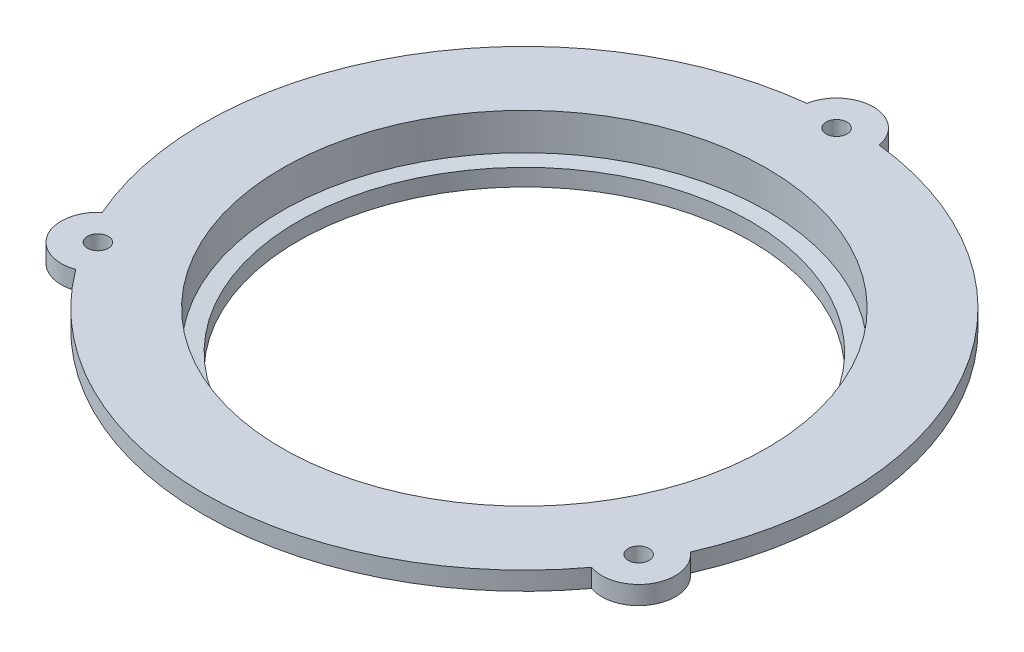
ISO-10303-21;
HEADER;
FILE_DESCRIPTION(('STEP AP214'),'2;1');
FILE_NAME('part.step','',(''),(''),'','','');
FILE_SCHEMA(('AUTOMOTIVE_DESIGN { 1 0 10303 214 1 1 1 1 }'));
ENDSEC;
DATA;
#1=APPLICATION_CONTEXT('core data for automotive mechanical design processes');
#2=APPLICATION_PROTOCOL_DEFINITION('international standard','automotive_design',2000,#1);
#3=PRODUCT_CONTEXT('',#1,'mechanical');
#4=PRODUCT('Part','Part','',(#3));
#5=PRODUCT_RELATED_PRODUCT_CATEGORY('part','',(#4));
#6=PRODUCT_DEFINITION_FORMATION('','',#4);
#7=PRODUCT_DEFINITION_CONTEXT('part definition',#1,'design');
#8=PRODUCT_DEFINITION('design','',#6,#7);
#9=PRODUCT_DEFINITION_SHAPE('','',#8);
#10=(LENGTH_UNIT() NAMED_UNIT(*) SI_UNIT(.MILLI.,.METRE.));
#11=(NAMED_UNIT(*) PLANE_ANGLE_UNIT() SI_UNIT($,.RADIAN.));
#12=(NAMED_UNIT(*) SI_UNIT($,.STERADIAN.) SOLID_ANGLE_UNIT());
#13=UNCERTAINTY_MEASURE_WITH_UNIT(LENGTH_MEASURE(1.E-05),#10,'distance_accuracy_value','');
#14=(GEOMETRIC_REPRESENTATION_CONTEXT(3) GLOBAL_UNCERTAINTY_ASSIGNED_CONTEXT((#13)) GLOBAL_UNIT_ASSIGNED_CONTEXT((#10,
#11,#12)) REPRESENTATION_CONTEXT('',''));
#15=CARTESIAN_POINT('',(0.,0.,0.));
#16=DIRECTION('',(0.,0.,1.));
#17=DIRECTION('',(1.,0.,0.));
#18=AXIS2_PLACEMENT_3D('',#15,#16,#17);
#19=CARTESIAN_POINT('',(0.,0.,0.));
#20=DIRECTION('',(0.,-1.,0.));
#21=DIRECTION('',(0.,0.,-1.));
#22=AXIS2_PLACEMENT_3D('',#19,#20,#21);
#23=CYLINDRICAL_SURFACE('',#22,52.4);
#24=DIRECTION('',(0.,1.,0.));
#25=VECTOR('',#24,1.);
#26=CARTESIAN_POINT('',(-42.1384690132501,2.13287604060485,31.146579735492));
#27=LINE('',#26,#25);
#28=CARTESIAN_POINT('',(-42.1384690132501,2.13287604060484,31.146579735492));
#29=VERTEX_POINT('',#28);
#30=CARTESIAN_POINT('',(-42.1384690132501,5.13287604060485,31.146579735492));
#31=VERTEX_POINT('',#30);
#32=EDGE_CURVE('E55',#29,#31,#27,.T.);
#33=ORIENTED_EDGE('',*,*,#32,.F.);
#34=CARTESIAN_POINT('',(0.,2.13287604060484,0.));
#35=DIRECTION('',(0.,-1.,0.));
#36=DIRECTION('',(0.,0.,-1.));
#37=AXIS2_PLACEMENT_3D('',#34,#35,#36);
#38=CIRCLE('',#37,52.4);
#39=CARTESIAN_POINT('',(42.1384690132497,2.13287604060484,31.1465797354925));
#40=VERTEX_POINT('',#39);
#41=EDGE_CURVE('E150',#40,#29,#38,.T.);
#42=ORIENTED_EDGE('',*,*,#41,.F.);
#43=DIRECTION('',(0.,1.,0.));
#44=VECTOR('',#43,1.);
#45=CARTESIAN_POINT('',(42.1384690132497,2.13287604060485,31.1465797354926));
#46=LINE('',#45,#44);
#47=CARTESIAN_POINT('',(42.1384690132497,5.13287604060485,31.1465797354926));
#48=VERTEX_POINT('',#47);
#49=EDGE_CURVE('E118',#40,#48,#46,.T.);
#50=ORIENTED_EDGE('',*,*,#49,.T.);
#51=CARTESIAN_POINT('',(0.,5.13287604060484,0.));
#52=DIRECTION('',(0.,-1.,0.));
#53=DIRECTION('',(0.,0.,-1.));
#54=AXIS2_PLACEMENT_3D('',#51,#52,#53);
#55=CIRCLE('',#54,52.4);
#56=EDGE_CURVE('E94',#48,#31,#55,.T.);
#57=ORIENTED_EDGE('',*,*,#56,.T.);
#58=EDGE_LOOP('',(#33,#42,#50,#57));
#59=FACE_BOUND('',#58,.T.);
#60=ADVANCED_FACE('F32',(#59),#23,.T.);
#61=DIRECTION('',(0.,1.,0.));
#62=VECTOR('',#61,1.);
#63=CARTESIAN_POINT('',(48.0429637985588,2.13287604060485,20.9196947743118));
#64=LINE('',#63,#62);
#65=CARTESIAN_POINT('',(48.0429637985588,2.13287604060484,20.9196947743118));
#66=VERTEX_POINT('',#65);
#67=CARTESIAN_POINT('',(48.0429637985588,5.13287604060485,20.9196947743118));
#68=VERTEX_POINT('',#67);
#69=EDGE_CURVE('E121',#66,#68,#64,.T.);
#70=ORIENTED_EDGE('',*,*,#69,.F.);
#71=CARTESIAN_POINT('',(5.9044947853091,2.13287604060484,-52.0662745098039));
#72=VERTEX_POINT('',#71);
#73=EDGE_CURVE('E146',#72,#66,#38,.T.);
#74=ORIENTED_EDGE('',*,*,#73,.F.);
#75=DIRECTION('',(0.,1.,0.));
#76=VECTOR('',#75,1.);
#77=CARTESIAN_POINT('',(5.9044947853091,2.13287604060485,-52.0662745098039));
#78=LINE('',#77,#76);
#79=CARTESIAN_POINT('',(5.9044947853091,5.13287604060485,-52.0662745098039));
#80=VERTEX_POINT('',#79);
#81=EDGE_CURVE('E135',#72,#80,#78,.T.);
#82=ORIENTED_EDGE('',*,*,#81,.T.);
#83=EDGE_CURVE('E97',#80,#68,#55,.T.);
#84=ORIENTED_EDGE('',*,*,#83,.T.);
#85=EDGE_LOOP('',(#70,#74,#82,#84));
#86=FACE_BOUND('',#85,.T.);
#87=ADVANCED_FACE('F193',(#86),#23,.T.);
#88=CARTESIAN_POINT('',(-48.0429637985591,2.13287604060484,20.9196947743111));
#89=VERTEX_POINT('',#88);
#90=CARTESIAN_POINT('',(-5.9044947853091,2.13287604060484,-52.0662745098039));
#91=VERTEX_POINT('',#90);
#92=EDGE_CURVE('E47',#89,#91,#38,.T.);
#93=ORIENTED_EDGE('',*,*,#92,.F.);
#94=DIRECTION('',(0.,1.,0.));
#95=VECTOR('',#94,1.);
#96=CARTESIAN_POINT('',(-48.0429637985591,2.13287604060485,20.9196947743111));
#97=LINE('',#96,#95);
#98=CARTESIAN_POINT('',(-48.0429637985591,5.13287604060485,20.9196947743111));
#99=VERTEX_POINT('',#98);
#100=EDGE_CURVE('E99',#89,#99,#97,.T.);
#101=ORIENTED_EDGE('',*,*,#100,.T.);
#102=CARTESIAN_POINT('',(-5.90449478530909,5.13287604060485,-52.0662745098039));
#103=VERTEX_POINT('',#102);
#104=EDGE_CURVE('E86',#99,#103,#55,.T.);
#105=ORIENTED_EDGE('',*,*,#104,.T.);
#106=DIRECTION('',(0.,1.,0.));
#107=VECTOR('',#106,1.);
#108=CARTESIAN_POINT('',(-5.9044947853091,2.13287604060485,-52.0662745098039));
#109=LINE('',#108,#107);
#110=EDGE_CURVE('E137',#91,#103,#109,.T.);
#111=ORIENTED_EDGE('',*,*,#110,.F.);
#112=EDGE_LOOP('',(#93,#101,#105,#111));
#113=FACE_BOUND('',#112,.T.);
#114=ADVANCED_FACE('F100',(#113),#23,.T.);
#115=CARTESIAN_POINT('',(0.,167.558031958265,0.));
#116=DIRECTION('',(0.,-1.,0.));
#117=DIRECTION('',(0.,0.,-1.));
#118=AXIS2_PLACEMENT_3D('',#115,#116,#117);
#119=DEGENERATE_TOROIDAL_SURFACE('',#118,23.7384172505589,169.170396208099,.T.);
#120=CARTESIAN_POINT('',(0.,-0.867123959395137,0.));
#121=DIRECTION('',(0.,-1.,0.));
#122=DIRECTION('',(0.,0.,-1.));
#123=AXIS2_PLACEMENT_3D('',#120,#121,#122);
#124=CIRCLE('',#123,39.6);
#125=CARTESIAN_POINT('',(0.,-0.867123959395137,-39.6));
#126=VERTEX_POINT('',#125);
#127=EDGE_CURVE('E139',#126,#126,#124,.T.);
#128=ORIENTED_EDGE('',*,*,#127,.F.);
#129=EDGE_LOOP('',(#128));
#130=FACE_BOUND('',#129,.T.);
#131=CARTESIAN_POINT('',(0.,-1.09176310886582,0.));
#132=DIRECTION('',(0.,-1.,0.));
#133=DIRECTION('',(0.,0.,-1.));
#134=AXIS2_PLACEMENT_3D('',#131,#132,#133);
#135=CIRCLE('',#134,37.);
#136=CARTESIAN_POINT('',(0.,-1.09176310886582,-37.));
#137=VERTEX_POINT('',#136);
#138=EDGE_CURVE('E11',#137,#137,#135,.T.);
#139=ORIENTED_EDGE('',*,*,#138,.T.);
#140=EDGE_LOOP('',(#139));
#141=FACE_BOUND('',#140,.T.);
#142=ADVANCED_FACE('F34',(#130,#141),#119,.F.);
#143=CARTESIAN_POINT('',(0.,0.,0.));
#144=DIRECTION('',(0.,-1.,0.));
#145=DIRECTION('',(0.,0.,-1.));
#146=AXIS2_PLACEMENT_3D('',#143,#144,#145);
#147=CYLINDRICAL_SURFACE('',#146,37.);
#148=ORIENTED_EDGE('',*,*,#138,.F.);
#149=EDGE_LOOP('',(#148));
#150=FACE_BOUND('',#149,.T.);
#151=CARTESIAN_POINT('',(0.,-3.86712395939514,0.));
#152=DIRECTION('',(0.,-1.,0.));
#153=DIRECTION('',(0.,0.,-1.));
#154=AXIS2_PLACEMENT_3D('',#151,#152,#153);
#155=CIRCLE('',#154,37.);
#156=CARTESIAN_POINT('',(0.,-3.86712395939514,-37.));
#157=VERTEX_POINT('',#156);
#158=EDGE_CURVE('E40',#157,#157,#155,.T.);
#159=ORIENTED_EDGE('',*,*,#158,.T.);
#160=EDGE_LOOP('',(#159));
#161=FACE_BOUND('',#160,.T.);
#162=ADVANCED_FACE('F161',(#150,#161),#147,.F.);
#163=CARTESIAN_POINT('',(-42.,-3.86712395939514,0.));
#164=DIRECTION('',(0.,1.,0.));
#165=DIRECTION('',(0.,0.,1.));
#166=AXIS2_PLACEMENT_3D('',#163,#164,#165);
#167=PLANE('',#166);
#168=ORIENTED_EDGE('',*,*,#158,.F.);
#169=EDGE_LOOP('',(#168));
#170=FACE_BOUND('',#169,.T.);
#171=CARTESIAN_POINT('',(0.,-3.86712395939514,0.));
#172=DIRECTION('',(0.,-1.,0.));
#173=DIRECTION('',(0.,0.,-1.));
#174=AXIS2_PLACEMENT_3D('',#171,#172,#173);
#175=CIRCLE('',#174,42.);
#176=CARTESIAN_POINT('',(0.,-3.86712395939514,-42.));
#177=VERTEX_POINT('',#176);
#178=EDGE_CURVE('E156',#177,#177,#175,.T.);
#179=ORIENTED_EDGE('',*,*,#178,.T.);
#180=EDGE_LOOP('',(#179));
#181=FACE_BOUND('',#180,.T.);
#182=ADVANCED_FACE('F163',(#170,#181),#167,.F.);
#183=CARTESIAN_POINT('',(0.,-0.867123959395164,0.));
#184=DIRECTION('',(0.,1.,0.));
#185=DIRECTION('',(0.,0.,1.));
#186=AXIS2_PLACEMENT_3D('',#183,#184,#185);
#187=CONICAL_SURFACE('',#186,47.4,1.06369782240256);
#188=ORIENTED_EDGE('',*,*,#178,.F.);
#189=EDGE_LOOP('',(#188));
#190=FACE_BOUND('',#189,.T.);
#191=CARTESIAN_POINT('',(0.,-0.867123959395164,0.));
#192=DIRECTION('',(0.,-1.,0.));
#193=DIRECTION('',(0.,0.,-1.));
#194=AXIS2_PLACEMENT_3D('',#191,#192,#193);
#195=CIRCLE('',#194,47.4);
#196=CARTESIAN_POINT('',(0.,-0.867123959395164,-47.4));
#197=VERTEX_POINT('',#196);
#198=EDGE_CURVE('E153',#197,#197,#195,.T.);
#199=ORIENTED_EDGE('',*,*,#198,.T.);
#200=EDGE_LOOP('',(#199));
#201=FACE_BOUND('',#200,.T.);
#202=ADVANCED_FACE('F166',(#190,#201),#187,.T.);
#203=CARTESIAN_POINT('',(0.,0.,0.));
#204=DIRECTION('',(0.,-1.,0.));
#205=DIRECTION('',(0.,0.,-1.));
#206=AXIS2_PLACEMENT_3D('',#203,#204,#205);
#207=CYLINDRICAL_SURFACE('',#206,47.4);
#208=ORIENTED_EDGE('',*,*,#198,.F.);
#209=EDGE_LOOP('',(#208));
#210=FACE_BOUND('',#209,.T.);
#211=CARTESIAN_POINT('',(0.,2.13287604060484,0.));
#212=DIRECTION('',(0.,-1.,0.));
#213=DIRECTION('',(0.,0.,-1.));
#214=AXIS2_PLACEMENT_3D('',#211,#212,#213);
#215=CIRCLE('',#214,47.4);
#216=CARTESIAN_POINT('',(0.,2.13287604060484,-47.4));
#217=VERTEX_POINT('',#216);
#218=EDGE_CURVE('E149',#217,#217,#215,.T.);
#219=ORIENTED_EDGE('',*,*,#218,.T.);
#220=EDGE_LOOP('',(#219));
#221=FACE_BOUND('',#220,.T.);
#222=ADVANCED_FACE('F172',(#210,#221),#207,.T.);
#223=CARTESIAN_POINT('',(-52.4,2.13287604060484,0.));
#224=DIRECTION('',(0.,1.,0.));
#225=DIRECTION('',(0.,0.,1.));
#226=AXIS2_PLACEMENT_3D('',#223,#224,#225);
#227=PLANE('',#226);
#228=CARTESIAN_POINT('',(-44.1672955930066,2.13287604060484,25.4999999999996));
#229=DIRECTION('',(0.,1.,0.));
#230=DIRECTION('',(0.,0.,1.));
#231=AXIS2_PLACEMENT_3D('',#228,#229,#230);
#232=CIRCLE('',#231,1.69999999999999);
#233=CARTESIAN_POINT('',(-44.1672955930066,2.13287604060484,27.1999999999996));
#234=VERTEX_POINT('',#233);
#235=EDGE_CURVE('E251',#234,#234,#232,.T.);
#236=ORIENTED_EDGE('',*,*,#235,.T.);
#237=EDGE_LOOP('',(#236));
#238=FACE_BOUND('',#237,.T.);
#239=CARTESIAN_POINT('',(44.1672955930063,2.13287604060484,25.5000000000002));
#240=DIRECTION('',(0.,1.,0.));
#241=DIRECTION('',(0.,0.,1.));
#242=AXIS2_PLACEMENT_3D('',#239,#240,#241);
#243=CIRCLE('',#242,1.69999999999999);
#244=CARTESIAN_POINT('',(44.1672955930063,2.13287604060484,27.2000000000002));
#245=VERTEX_POINT('',#244);
#246=EDGE_CURVE('E106',#245,#245,#243,.T.);
#247=ORIENTED_EDGE('',*,*,#246,.T.);
#248=EDGE_LOOP('',(#247));
#249=FACE_BOUND('',#248,.T.);
#250=CARTESIAN_POINT('',(0.,2.13287604060484,-51.));
#251=DIRECTION('',(0.,1.,0.));
#252=DIRECTION('',(0.,0.,1.));
#253=AXIS2_PLACEMENT_3D('',#250,#251,#252);
#254=CIRCLE('',#253,1.69999999999999);
#255=CARTESIAN_POINT('',(0.,2.13287604060484,-49.3));
#256=VERTEX_POINT('',#255);
#257=EDGE_CURVE('E129',#256,#256,#254,.T.);
#258=ORIENTED_EDGE('',*,*,#257,.T.);
#259=EDGE_LOOP('',(#258));
#260=FACE_BOUND('',#259,.T.);
#261=ORIENTED_EDGE('',*,*,#218,.F.);
#262=EDGE_LOOP('',(#261));
#263=FACE_BOUND('',#262,.T.);
#264=ORIENTED_EDGE('',*,*,#41,.T.);
#265=CARTESIAN_POINT('',(-44.1672955930066,2.13287604060485,25.4999999999996));
#266=DIRECTION('',(0.,-1.,0.));
#267=DIRECTION('',(-0.866025403784443,0.,0.499999999999992));
#268=AXIS2_PLACEMENT_3D('',#265,#266,#267);
#269=CIRCLE('',#268,6.);
#270=EDGE_CURVE('E103',#29,#89,#269,.T.);
#271=ORIENTED_EDGE('',*,*,#270,.T.);
#272=ORIENTED_EDGE('',*,*,#92,.T.);
#273=CARTESIAN_POINT('',(0.,2.13287604060485,-51.));
#274=DIRECTION('',(0.,-1.,0.));
#275=DIRECTION('',(0.,0.,-1.));
#276=AXIS2_PLACEMENT_3D('',#273,#274,#275);
#277=CIRCLE('',#276,6.);
#278=EDGE_CURVE('E132',#91,#72,#277,.T.);
#279=ORIENTED_EDGE('',*,*,#278,.T.);
#280=ORIENTED_EDGE('',*,*,#73,.T.);
#281=CARTESIAN_POINT('',(44.1672955930063,2.13287604060485,25.5000000000002));
#282=DIRECTION('',(0.,-1.,0.));
#283=DIRECTION('',(0.866025403784436,0.,0.500000000000004));
#284=AXIS2_PLACEMENT_3D('',#281,#282,#283);
#285=CIRCLE('',#284,6.);
#286=EDGE_CURVE('E115',#66,#40,#285,.T.);
#287=ORIENTED_EDGE('',*,*,#286,.T.);
#288=EDGE_LOOP('',(#264,#271,#272,#279,#280,#287));
#289=FACE_BOUND('',#288,.T.);
#290=ADVANCED_FACE('F178',(#238,#249,#260,#263,#289),#227,.F.);
#291=CARTESIAN_POINT('',(-39.6,5.13287604060485,0.));
#292=DIRECTION('',(0.,-1.,0.));
#293=DIRECTION('',(0.,0.,-1.));
#294=AXIS2_PLACEMENT_3D('',#291,#292,#293);
#295=PLANE('',#294);
#296=CARTESIAN_POINT('',(-44.1672955930066,5.13287604060485,25.4999999999996));
#297=DIRECTION('',(0.,1.,0.));
#298=DIRECTION('',(0.,0.,1.));
#299=AXIS2_PLACEMENT_3D('',#296,#297,#298);
#300=CIRCLE('',#299,1.69999999999999);
#301=CARTESIAN_POINT('',(-44.1672955930066,5.13287604060485,27.1999999999996));
#302=VERTEX_POINT('',#301);
#303=EDGE_CURVE('E248',#302,#302,#300,.T.);
#304=ORIENTED_EDGE('',*,*,#303,.F.);
#305=EDGE_LOOP('',(#304));
#306=FACE_BOUND('',#305,.T.);
#307=CARTESIAN_POINT('',(44.1672955930063,5.13287604060485,25.5000000000002));
#308=DIRECTION('',(0.,1.,0.));
#309=DIRECTION('',(0.,0.,1.));
#310=AXIS2_PLACEMENT_3D('',#307,#308,#309);
#311=CIRCLE('',#310,1.69999999999999);
#312=CARTESIAN_POINT('',(44.1672955930063,5.13287604060485,27.2000000000002));
#313=VERTEX_POINT('',#312);
#314=EDGE_CURVE('E110',#313,#313,#311,.T.);
#315=ORIENTED_EDGE('',*,*,#314,.F.);
#316=EDGE_LOOP('',(#315));
#317=FACE_BOUND('',#316,.T.);
#318=ORIENTED_EDGE('',*,*,#104,.F.);
#319=CARTESIAN_POINT('',(-44.1672955930066,5.13287604060485,25.4999999999996));
#320=DIRECTION('',(0.,-1.,0.));
#321=DIRECTION('',(-0.866025403784443,0.,0.499999999999992));
#322=AXIS2_PLACEMENT_3D('',#319,#320,#321);
#323=CIRCLE('',#322,6.);
#324=EDGE_CURVE('E90',#31,#99,#323,.T.);
#325=ORIENTED_EDGE('',*,*,#324,.F.);
#326=ORIENTED_EDGE('',*,*,#56,.F.);
#327=CARTESIAN_POINT('',(44.1672955930063,5.13287604060485,25.5000000000002));
#328=DIRECTION('',(0.,-1.,0.));
#329=DIRECTION('',(0.866025403784436,0.,0.500000000000004));
#330=AXIS2_PLACEMENT_3D('',#327,#328,#329);
#331=CIRCLE('',#330,6.);
#332=EDGE_CURVE('E113',#68,#48,#331,.T.);
#333=ORIENTED_EDGE('',*,*,#332,.F.);
#334=ORIENTED_EDGE('',*,*,#83,.F.);
#335=CARTESIAN_POINT('',(0.,5.13287604060485,-51.));
#336=DIRECTION('',(0.,-1.,0.));
#337=DIRECTION('',(0.,0.,-1.));
#338=AXIS2_PLACEMENT_3D('',#335,#336,#337);
#339=CIRCLE('',#338,6.);
#340=EDGE_CURVE('E92',#103,#80,#339,.T.);
#341=ORIENTED_EDGE('',*,*,#340,.F.);
#342=EDGE_LOOP('',(#318,#325,#326,#333,#334,#341));
#343=FACE_BOUND('',#342,.T.);
#344=CARTESIAN_POINT('',(0.,5.13287604060485,-51.));
#345=DIRECTION('',(0.,1.,0.));
#346=DIRECTION('',(0.,0.,1.));
#347=AXIS2_PLACEMENT_3D('',#344,#345,#346);
#348=CIRCLE('',#347,1.69999999999999);
#349=CARTESIAN_POINT('',(0.,5.13287604060485,-49.3));
#350=VERTEX_POINT('',#349);
#351=EDGE_CURVE('E124',#350,#350,#348,.T.);
#352=ORIENTED_EDGE('',*,*,#351,.F.);
#353=EDGE_LOOP('',(#352));
#354=FACE_BOUND('',#353,.T.);
#355=CARTESIAN_POINT('',(0.,5.13287604060486,0.));
#356=DIRECTION('',(0.,-1.,0.));
#357=DIRECTION('',(0.,0.,-1.));
#358=AXIS2_PLACEMENT_3D('',#355,#356,#357);
#359=CIRCLE('',#358,39.6);
#360=CARTESIAN_POINT('',(0.,5.13287604060486,-39.6));
#361=VERTEX_POINT('',#360);
#362=EDGE_CURVE('E95',#361,#361,#359,.T.);
#363=ORIENTED_EDGE('',*,*,#362,.T.);
#364=EDGE_LOOP('',(#363));
#365=FACE_BOUND('',#364,.T.);
#366=ADVANCED_FACE('F87',(#306,#317,#343,#354,#365),#295,.F.);
#367=CARTESIAN_POINT('',(0.,0.,0.));
#368=DIRECTION('',(0.,-1.,0.));
#369=DIRECTION('',(0.,0.,-1.));
#370=AXIS2_PLACEMENT_3D('',#367,#368,#369);
#371=CYLINDRICAL_SURFACE('',#370,39.6);
#372=ORIENTED_EDGE('',*,*,#362,.F.);
#373=EDGE_LOOP('',(#372));
#374=FACE_BOUND('',#373,.T.);
#375=ORIENTED_EDGE('',*,*,#127,.T.);
#376=EDGE_LOOP('',(#375));
#377=FACE_BOUND('',#376,.T.);
#378=ADVANCED_FACE('F216',(#374,#377),#371,.F.);
#379=CARTESIAN_POINT('',(0.,2.13287604060485,-51.));
#380=DIRECTION('',(0.,1.,0.));
#381=DIRECTION('',(0.,0.,1.));
#382=AXIS2_PLACEMENT_3D('',#379,#380,#381);
#383=CYLINDRICAL_SURFACE('',#382,6.);
#384=ORIENTED_EDGE('',*,*,#340,.T.);
#385=ORIENTED_EDGE('',*,*,#81,.F.);
#386=ORIENTED_EDGE('',*,*,#278,.F.);
#387=ORIENTED_EDGE('',*,*,#110,.T.);
#388=EDGE_LOOP('',(#384,#385,#386,#387));
#389=FACE_BOUND('',#388,.T.);
#390=ADVANCED_FACE('F191',(#389),#383,.T.);
#391=CARTESIAN_POINT('',(0.,5.13287604060485,-51.));
#392=DIRECTION('',(0.,1.,0.));
#393=DIRECTION('',(0.,0.,1.));
#394=AXIS2_PLACEMENT_3D('',#391,#392,#393);
#395=CYLINDRICAL_SURFACE('',#394,1.69999999999999);
#396=ORIENTED_EDGE('',*,*,#351,.T.);
#397=EDGE_LOOP('',(#396));
#398=FACE_BOUND('',#397,.T.);
#399=ORIENTED_EDGE('',*,*,#257,.F.);
#400=EDGE_LOOP('',(#399));
#401=FACE_BOUND('',#400,.T.);
#402=ADVANCED_FACE('F224',(#398,#401),#395,.F.);
#403=CARTESIAN_POINT('',(44.1672955930063,2.13287604060485,25.5000000000002));
#404=DIRECTION('',(0.,1.,0.));
#405=DIRECTION('',(0.,0.,1.));
#406=AXIS2_PLACEMENT_3D('',#403,#404,#405);
#407=CYLINDRICAL_SURFACE('',#406,6.);
#408=ORIENTED_EDGE('',*,*,#332,.T.);
#409=ORIENTED_EDGE('',*,*,#49,.F.);
#410=ORIENTED_EDGE('',*,*,#286,.F.);
#411=ORIENTED_EDGE('',*,*,#69,.T.);
#412=EDGE_LOOP('',(#408,#409,#410,#411));
#413=FACE_BOUND('',#412,.T.);
#414=ADVANCED_FACE('F195',(#413),#407,.T.);
#415=CARTESIAN_POINT('',(-44.1672955930066,2.13287604060485,25.4999999999996));
#416=DIRECTION('',(0.,1.,0.));
#417=DIRECTION('',(0.,0.,1.));
#418=AXIS2_PLACEMENT_3D('',#415,#416,#417);
#419=CYLINDRICAL_SURFACE('',#418,6.);
#420=ORIENTED_EDGE('',*,*,#324,.T.);
#421=ORIENTED_EDGE('',*,*,#100,.F.);
#422=ORIENTED_EDGE('',*,*,#270,.F.);
#423=ORIENTED_EDGE('',*,*,#32,.T.);
#424=EDGE_LOOP('',(#420,#421,#422,#423));
#425=FACE_BOUND('',#424,.T.);
#426=ADVANCED_FACE('F105',(#425),#419,.T.);
#427=CARTESIAN_POINT('',(44.1672955930063,5.13287604060485,25.5000000000002));
#428=DIRECTION('',(0.,1.,0.));
#429=DIRECTION('',(0.,0.,1.));
#430=AXIS2_PLACEMENT_3D('',#427,#428,#429);
#431=CYLINDRICAL_SURFACE('',#430,1.69999999999999);
#432=ORIENTED_EDGE('',*,*,#314,.T.);
#433=EDGE_LOOP('',(#432));
#434=FACE_BOUND('',#433,.T.);
#435=ORIENTED_EDGE('',*,*,#246,.F.);
#436=EDGE_LOOP('',(#435));
#437=FACE_BOUND('',#436,.T.);
#438=ADVANCED_FACE('F236',(#434,#437),#431,.F.);
#439=CARTESIAN_POINT('',(-44.1672955930066,5.13287604060485,25.4999999999996));
#440=DIRECTION('',(0.,1.,0.));
#441=DIRECTION('',(0.,0.,1.));
#442=AXIS2_PLACEMENT_3D('',#439,#440,#441);
#443=CYLINDRICAL_SURFACE('',#442,1.69999999999999);
#444=ORIENTED_EDGE('',*,*,#303,.T.);
#445=EDGE_LOOP('',(#444));
#446=FACE_BOUND('',#445,.T.);
#447=ORIENTED_EDGE('',*,*,#235,.F.);
#448=EDGE_LOOP('',(#447));
#449=FACE_BOUND('',#448,.T.);
#450=ADVANCED_FACE('F239',(#446,#449),#443,.F.);
#451=CLOSED_SHELL('',(#60,#87,#114,#142,#162,#182,#202,#222,#290,#366,#378,#390,#402,#414,#426,
#438,#450));
#452=MANIFOLD_SOLID_BREP('B2',#451);
#453=ADVANCED_BREP_SHAPE_REPRESENTATION('',(#18,#452),#14);
#454=SHAPE_DEFINITION_REPRESENTATION(#9,#453);
ENDSEC;
END-ISO-10303-21;
